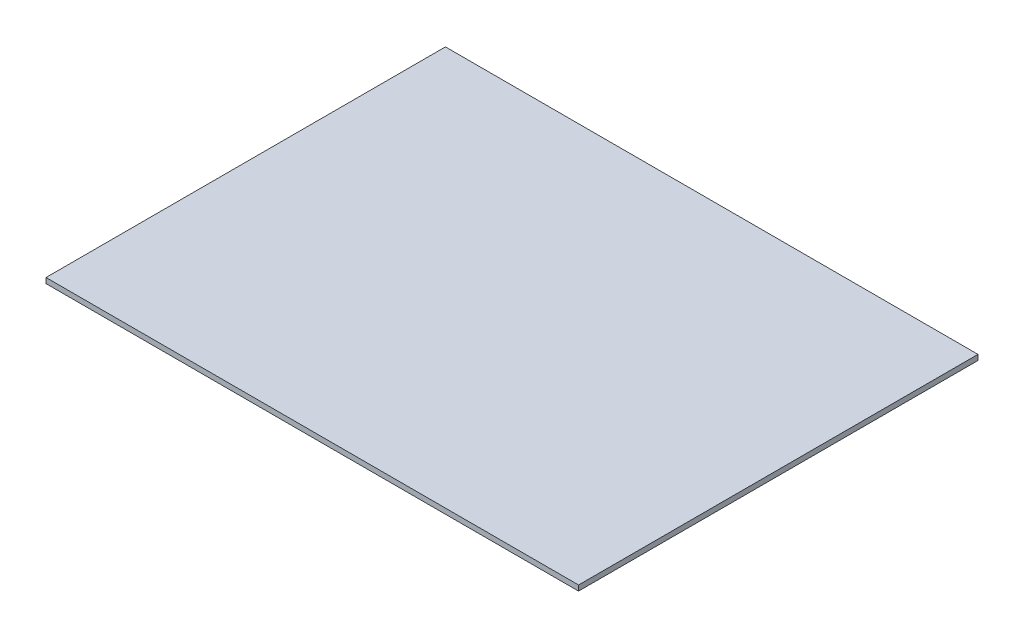
ISO-10303-21;
HEADER;
FILE_DESCRIPTION(('STEP AP214'),'2;1');
FILE_NAME('part.step','',(''),(''),'','','');
FILE_SCHEMA(('AUTOMOTIVE_DESIGN { 1 0 10303 214 1 1 1 1 }'));
ENDSEC;
DATA;
#1=APPLICATION_CONTEXT('core data for automotive mechanical design processes');
#2=APPLICATION_PROTOCOL_DEFINITION('international standard','automotive_design',2000,#1);
#3=PRODUCT_CONTEXT('',#1,'mechanical');
#4=PRODUCT('Part','Part','',(#3));
#5=PRODUCT_RELATED_PRODUCT_CATEGORY('part','',(#4));
#6=PRODUCT_DEFINITION_FORMATION('','',#4);
#7=PRODUCT_DEFINITION_CONTEXT('part definition',#1,'design');
#8=PRODUCT_DEFINITION('design','',#6,#7);
#9=PRODUCT_DEFINITION_SHAPE('','',#8);
#10=(LENGTH_UNIT() NAMED_UNIT(*) SI_UNIT(.MILLI.,.METRE.));
#11=(NAMED_UNIT(*) PLANE_ANGLE_UNIT() SI_UNIT($,.RADIAN.));
#12=(NAMED_UNIT(*) SI_UNIT($,.STERADIAN.) SOLID_ANGLE_UNIT());
#13=UNCERTAINTY_MEASURE_WITH_UNIT(LENGTH_MEASURE(1.E-05),#10,'distance_accuracy_value','');
#14=(GEOMETRIC_REPRESENTATION_CONTEXT(3) GLOBAL_UNCERTAINTY_ASSIGNED_CONTEXT((#13)) GLOBAL_UNIT_ASSIGNED_CONTEXT((#10,
#11,#12)) REPRESENTATION_CONTEXT('',''));
#15=CARTESIAN_POINT('',(0.,0.,0.));
#16=DIRECTION('',(0.,0.,1.));
#17=DIRECTION('',(1.,0.,0.));
#18=AXIS2_PLACEMENT_3D('',#15,#16,#17);
#19=CARTESIAN_POINT('',(0.,2.,0.));
#20=DIRECTION('',(1.,0.,0.));
#21=DIRECTION('',(0.,0.,-1.));
#22=AXIS2_PLACEMENT_3D('',#19,#20,#21);
#23=PLANE('',#22);
#24=DIRECTION('',(0.,0.,1.));
#25=VECTOR('',#24,1.);
#26=CARTESIAN_POINT('',(0.,0.,0.));
#27=LINE('',#26,#25);
#28=CARTESIAN_POINT('',(0.,0.,-150.));
#29=VERTEX_POINT('',#28);
#30=CARTESIAN_POINT('',(0.,0.,0.));
#31=VERTEX_POINT('',#30);
#32=EDGE_CURVE('E113',#29,#31,#27,.T.);
#33=ORIENTED_EDGE('',*,*,#32,.T.);
#34=DIRECTION('',(0.,-1.,0.));
#35=VECTOR('',#34,1.);
#36=CARTESIAN_POINT('',(0.,2.,0.));
#37=LINE('',#36,#35);
#38=CARTESIAN_POINT('',(0.,2.,0.));
#39=VERTEX_POINT('',#38);
#40=EDGE_CURVE('E11',#39,#31,#37,.T.);
#41=ORIENTED_EDGE('',*,*,#40,.F.);
#42=DIRECTION('',(0.,0.,1.));
#43=VECTOR('',#42,1.);
#44=CARTESIAN_POINT('',(0.,2.,0.));
#45=LINE('',#44,#43);
#46=CARTESIAN_POINT('',(0.,2.,-150.));
#47=VERTEX_POINT('',#46);
#48=EDGE_CURVE('E97',#47,#39,#45,.T.);
#49=ORIENTED_EDGE('',*,*,#48,.F.);
#50=DIRECTION('',(0.,-1.,0.));
#51=VECTOR('',#50,1.);
#52=CARTESIAN_POINT('',(0.,2.,-150.));
#53=LINE('',#52,#51);
#54=EDGE_CURVE('E109',#47,#29,#53,.T.);
#55=ORIENTED_EDGE('',*,*,#54,.T.);
#56=EDGE_LOOP('',(#33,#41,#49,#55));
#57=FACE_BOUND('',#56,.T.);
#58=ADVANCED_FACE('F45',(#57),#23,.F.);
#59=CARTESIAN_POINT('',(0.,2.,0.));
#60=DIRECTION('',(0.,0.,-1.));
#61=DIRECTION('',(-1.,0.,0.));
#62=AXIS2_PLACEMENT_3D('',#59,#60,#61);
#63=PLANE('',#62);
#64=DIRECTION('',(1.,0.,0.));
#65=VECTOR('',#64,1.);
#66=CARTESIAN_POINT('',(0.,0.,0.));
#67=LINE('',#66,#65);
#68=CARTESIAN_POINT('',(200.,0.,0.));
#69=VERTEX_POINT('',#68);
#70=EDGE_CURVE('E102',#31,#69,#67,.T.);
#71=ORIENTED_EDGE('',*,*,#70,.T.);
#72=DIRECTION('',(0.,-1.,0.));
#73=VECTOR('',#72,1.);
#74=CARTESIAN_POINT('',(200.,2.,0.));
#75=LINE('',#74,#73);
#76=CARTESIAN_POINT('',(200.,2.,0.));
#77=VERTEX_POINT('',#76);
#78=EDGE_CURVE('E54',#77,#69,#75,.T.);
#79=ORIENTED_EDGE('',*,*,#78,.F.);
#80=DIRECTION('',(1.,0.,0.));
#81=VECTOR('',#80,1.);
#82=CARTESIAN_POINT('',(0.,2.,0.));
#83=LINE('',#82,#81);
#84=EDGE_CURVE('E92',#39,#77,#83,.T.);
#85=ORIENTED_EDGE('',*,*,#84,.F.);
#86=ORIENTED_EDGE('',*,*,#40,.T.);
#87=EDGE_LOOP('',(#71,#79,#85,#86));
#88=FACE_BOUND('',#87,.T.);
#89=ADVANCED_FACE('F101',(#88),#63,.F.);
#90=CARTESIAN_POINT('',(200.,2.,0.));
#91=DIRECTION('',(-1.,0.,0.));
#92=DIRECTION('',(0.,0.,1.));
#93=AXIS2_PLACEMENT_3D('',#90,#91,#92);
#94=PLANE('',#93);
#95=DIRECTION('',(0.,0.,-1.));
#96=VECTOR('',#95,1.);
#97=CARTESIAN_POINT('',(200.,0.,0.));
#98=LINE('',#97,#96);
#99=CARTESIAN_POINT('',(200.,0.,-150.));
#100=VERTEX_POINT('',#99);
#101=EDGE_CURVE('E79',#69,#100,#98,.T.);
#102=ORIENTED_EDGE('',*,*,#101,.T.);
#103=DIRECTION('',(0.,-1.,0.));
#104=VECTOR('',#103,1.);
#105=CARTESIAN_POINT('',(200.,2.,-150.));
#106=LINE('',#105,#104);
#107=CARTESIAN_POINT('',(200.,2.,-150.));
#108=VERTEX_POINT('',#107);
#109=EDGE_CURVE('E104',#108,#100,#106,.T.);
#110=ORIENTED_EDGE('',*,*,#109,.F.);
#111=DIRECTION('',(0.,0.,-1.));
#112=VECTOR('',#111,1.);
#113=CARTESIAN_POINT('',(200.,2.,0.));
#114=LINE('',#113,#112);
#115=EDGE_CURVE('E95',#77,#108,#114,.T.);
#116=ORIENTED_EDGE('',*,*,#115,.F.);
#117=ORIENTED_EDGE('',*,*,#78,.T.);
#118=EDGE_LOOP('',(#102,#110,#116,#117));
#119=FACE_BOUND('',#118,.T.);
#120=ADVANCED_FACE('F105',(#119),#94,.F.);
#121=CARTESIAN_POINT('',(0.,2.,-150.));
#122=DIRECTION('',(0.,0.,1.));
#123=DIRECTION('',(1.,0.,0.));
#124=AXIS2_PLACEMENT_3D('',#121,#122,#123);
#125=PLANE('',#124);
#126=DIRECTION('',(-1.,0.,0.));
#127=VECTOR('',#126,1.);
#128=CARTESIAN_POINT('',(0.,0.,-150.));
#129=LINE('',#128,#127);
#130=EDGE_CURVE('E85',#100,#29,#129,.T.);
#131=ORIENTED_EDGE('',*,*,#130,.T.);
#132=ORIENTED_EDGE('',*,*,#54,.F.);
#133=DIRECTION('',(-1.,0.,0.));
#134=VECTOR('',#133,1.);
#135=CARTESIAN_POINT('',(0.,2.,-150.));
#136=LINE('',#135,#134);
#137=EDGE_CURVE('E62',#108,#47,#136,.T.);
#138=ORIENTED_EDGE('',*,*,#137,.F.);
#139=ORIENTED_EDGE('',*,*,#109,.T.);
#140=EDGE_LOOP('',(#131,#132,#138,#139));
#141=FACE_BOUND('',#140,.T.);
#142=ADVANCED_FACE('F126',(#141),#125,.F.);
#143=CARTESIAN_POINT('',(0.,2.,0.));
#144=DIRECTION('',(0.,-1.,0.));
#145=DIRECTION('',(0.,0.,-1.));
#146=AXIS2_PLACEMENT_3D('',#143,#144,#145);
#147=PLANE('',#146);
#148=ORIENTED_EDGE('',*,*,#48,.T.);
#149=ORIENTED_EDGE('',*,*,#84,.T.);
#150=ORIENTED_EDGE('',*,*,#115,.T.);
#151=ORIENTED_EDGE('',*,*,#137,.T.);
#152=EDGE_LOOP('',(#148,#149,#150,#151));
#153=FACE_BOUND('',#152,.T.);
#154=ADVANCED_FACE('F93',(#153),#147,.F.);
#155=CARTESIAN_POINT('',(0.,0.,0.));
#156=DIRECTION('',(0.,-1.,0.));
#157=DIRECTION('',(0.,0.,-1.));
#158=AXIS2_PLACEMENT_3D('',#155,#156,#157);
#159=PLANE('',#158);
#160=ORIENTED_EDGE('',*,*,#32,.F.);
#161=ORIENTED_EDGE('',*,*,#130,.F.);
#162=ORIENTED_EDGE('',*,*,#101,.F.);
#163=ORIENTED_EDGE('',*,*,#70,.F.);
#164=EDGE_LOOP('',(#160,#161,#162,#163));
#165=FACE_BOUND('',#164,.T.);
#166=ADVANCED_FACE('F129',(#165),#159,.T.);
#167=CLOSED_SHELL('',(#58,#89,#120,#142,#154,#166));
#168=MANIFOLD_SOLID_BREP('B2',#167);
#169=ADVANCED_BREP_SHAPE_REPRESENTATION('',(#18,#168),#14);
#170=SHAPE_DEFINITION_REPRESENTATION(#9,#169);
ENDSEC;
END-ISO-10303-21;
